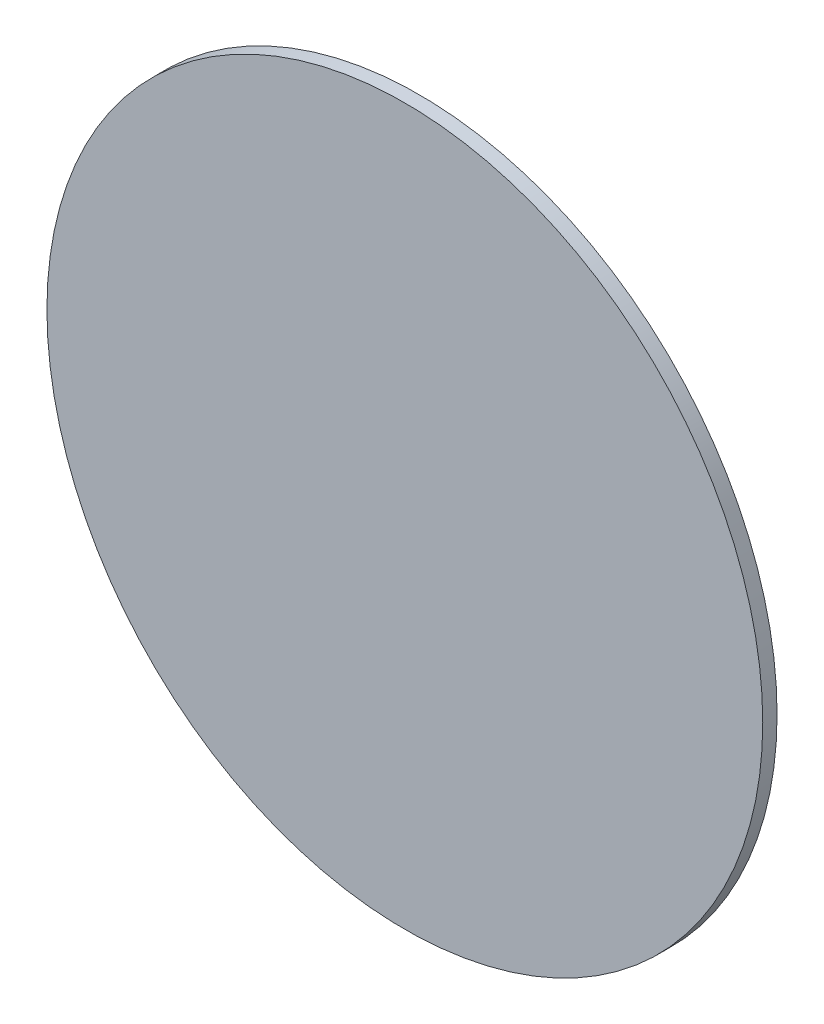
ISO-10303-21;
HEADER;
FILE_DESCRIPTION(('STEP AP214'),'2;1');
FILE_NAME('part.step','',(''),(''),'','','');
FILE_SCHEMA(('AUTOMOTIVE_DESIGN { 1 0 10303 214 1 1 1 1 }'));
ENDSEC;
DATA;
#1=APPLICATION_CONTEXT('core data for automotive mechanical design processes');
#2=APPLICATION_PROTOCOL_DEFINITION('international standard','automotive_design',2000,#1);
#3=PRODUCT_CONTEXT('',#1,'mechanical');
#4=PRODUCT('Part','Part','',(#3));
#5=PRODUCT_RELATED_PRODUCT_CATEGORY('part','',(#4));
#6=PRODUCT_DEFINITION_FORMATION('','',#4);
#7=PRODUCT_DEFINITION_CONTEXT('part definition',#1,'design');
#8=PRODUCT_DEFINITION('design','',#6,#7);
#9=PRODUCT_DEFINITION_SHAPE('','',#8);
#10=(LENGTH_UNIT() NAMED_UNIT(*) SI_UNIT(.MILLI.,.METRE.));
#11=(NAMED_UNIT(*) PLANE_ANGLE_UNIT() SI_UNIT($,.RADIAN.));
#12=(NAMED_UNIT(*) SI_UNIT($,.STERADIAN.) SOLID_ANGLE_UNIT());
#13=UNCERTAINTY_MEASURE_WITH_UNIT(LENGTH_MEASURE(1.E-05),#10,'distance_accuracy_value','');
#14=(GEOMETRIC_REPRESENTATION_CONTEXT(3) GLOBAL_UNCERTAINTY_ASSIGNED_CONTEXT((#13)) GLOBAL_UNIT_ASSIGNED_CONTEXT((#10,
#11,#12)) REPRESENTATION_CONTEXT('',''));
#15=CARTESIAN_POINT('',(0.,0.,0.));
#16=DIRECTION('',(0.,0.,1.));
#17=DIRECTION('',(1.,0.,0.));
#18=AXIS2_PLACEMENT_3D('',#15,#16,#17);
#19=CARTESIAN_POINT('',(0.,0.,20.));
#20=DIRECTION('',(0.,0.,-1.));
#21=DIRECTION('',(-1.,0.,0.));
#22=AXIS2_PLACEMENT_3D('',#19,#20,#21);
#23=CYLINDRICAL_SURFACE('',#22,500.);
#24=CARTESIAN_POINT('',(0.,0.,20.));
#25=DIRECTION('',(0.,0.,1.));
#26=DIRECTION('',(1.,0.,0.));
#27=AXIS2_PLACEMENT_3D('',#24,#25,#26);
#28=CIRCLE('',#27,500.);
#29=CARTESIAN_POINT('',(500.,0.,20.));
#30=VERTEX_POINT('',#29);
#31=EDGE_CURVE('E10',#30,#30,#28,.T.);
#32=ORIENTED_EDGE('',*,*,#31,.F.);
#33=EDGE_LOOP('',(#32));
#34=FACE_BOUND('',#33,.T.);
#35=CARTESIAN_POINT('',(0.,0.,0.));
#36=DIRECTION('',(0.,0.,1.));
#37=DIRECTION('',(1.,0.,0.));
#38=AXIS2_PLACEMENT_3D('',#35,#36,#37);
#39=CIRCLE('',#38,500.);
#40=CARTESIAN_POINT('',(500.,0.,0.));
#41=VERTEX_POINT('',#40);
#42=EDGE_CURVE('E46',#41,#41,#39,.T.);
#43=ORIENTED_EDGE('',*,*,#42,.T.);
#44=EDGE_LOOP('',(#43));
#45=FACE_BOUND('',#44,.T.);
#46=ADVANCED_FACE('F43',(#34,#45),#23,.T.);
#47=CARTESIAN_POINT('',(0.,0.,20.));
#48=DIRECTION('',(0.,0.,1.));
#49=DIRECTION('',(1.,0.,0.));
#50=AXIS2_PLACEMENT_3D('',#47,#48,#49);
#51=PLANE('',#50);
#52=ORIENTED_EDGE('',*,*,#31,.T.);
#53=EDGE_LOOP('',(#52));
#54=FACE_BOUND('',#53,.T.);
#55=ADVANCED_FACE('F60',(#54),#51,.T.);
#56=CARTESIAN_POINT('',(0.,0.,0.));
#57=DIRECTION('',(0.,0.,1.));
#58=DIRECTION('',(1.,0.,0.));
#59=AXIS2_PLACEMENT_3D('',#56,#57,#58);
#60=PLANE('',#59);
#61=ORIENTED_EDGE('',*,*,#42,.F.);
#62=EDGE_LOOP('',(#61));
#63=FACE_BOUND('',#62,.T.);
#64=ADVANCED_FACE('F58',(#63),#60,.F.);
#65=CLOSED_SHELL('',(#46,#55,#64));
#66=MANIFOLD_SOLID_BREP('B2',#65);
#67=ADVANCED_BREP_SHAPE_REPRESENTATION('',(#18,#66),#14);
#68=SHAPE_DEFINITION_REPRESENTATION(#9,#67);
ENDSEC;
END-ISO-10303-21;
